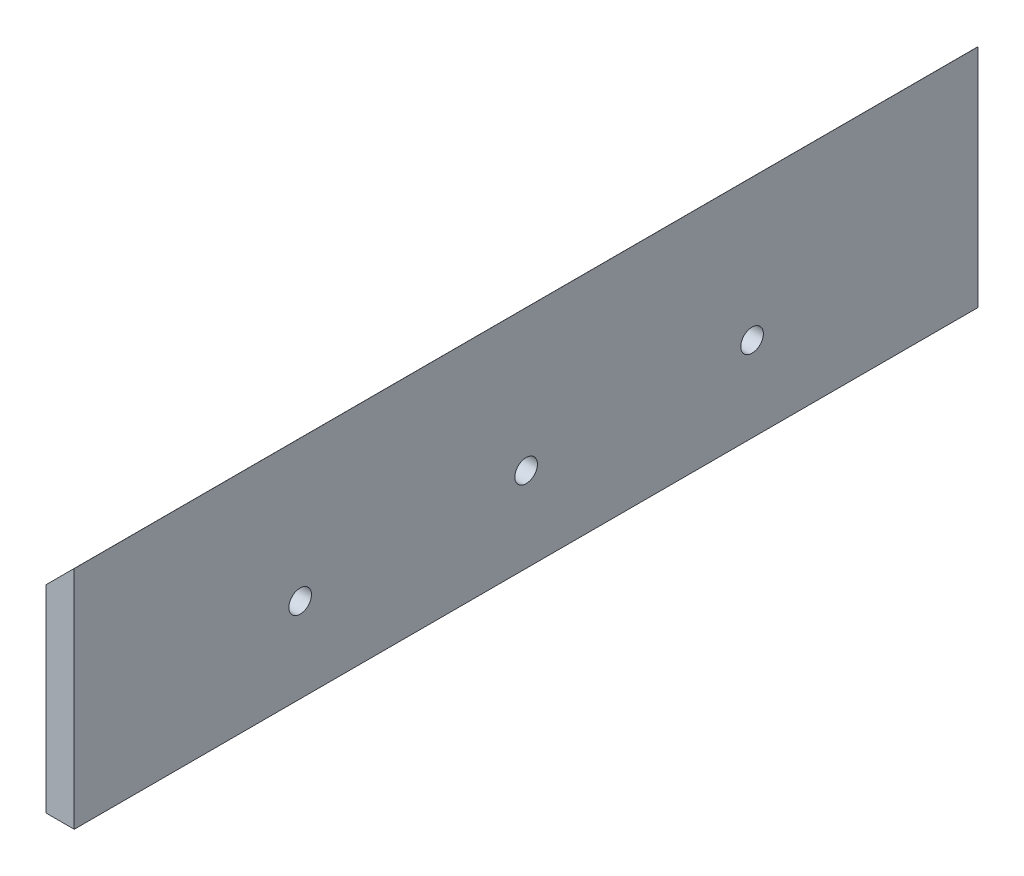
ISO-10303-21;
HEADER;
FILE_DESCRIPTION(('STEP AP214'),'2;1');
FILE_NAME('part.step','',(''),(''),'','','');
FILE_SCHEMA(('AUTOMOTIVE_DESIGN { 1 0 10303 214 1 1 1 1 }'));
ENDSEC;
DATA;
#1=APPLICATION_CONTEXT('core data for automotive mechanical design processes');
#2=APPLICATION_PROTOCOL_DEFINITION('international standard','automotive_design',2000,#1);
#3=PRODUCT_CONTEXT('',#1,'mechanical');
#4=PRODUCT('Part','Part','',(#3));
#5=PRODUCT_RELATED_PRODUCT_CATEGORY('part','',(#4));
#6=PRODUCT_DEFINITION_FORMATION('','',#4);
#7=PRODUCT_DEFINITION_CONTEXT('part definition',#1,'design');
#8=PRODUCT_DEFINITION('design','',#6,#7);
#9=PRODUCT_DEFINITION_SHAPE('','',#8);
#10=(LENGTH_UNIT() NAMED_UNIT(*) SI_UNIT(.MILLI.,.METRE.));
#11=(NAMED_UNIT(*) PLANE_ANGLE_UNIT() SI_UNIT($,.RADIAN.));
#12=(NAMED_UNIT(*) SI_UNIT($,.STERADIAN.) SOLID_ANGLE_UNIT());
#13=UNCERTAINTY_MEASURE_WITH_UNIT(LENGTH_MEASURE(1.E-05),#10,'distance_accuracy_value','');
#14=(GEOMETRIC_REPRESENTATION_CONTEXT(3) GLOBAL_UNCERTAINTY_ASSIGNED_CONTEXT((#13)) GLOBAL_UNIT_ASSIGNED_CONTEXT((#10,
#11,#12)) REPRESENTATION_CONTEXT('',''));
#15=CARTESIAN_POINT('',(0.,0.,0.));
#16=DIRECTION('',(0.,0.,1.));
#17=DIRECTION('',(1.,0.,0.));
#18=AXIS2_PLACEMENT_3D('',#15,#16,#17);
#19=CARTESIAN_POINT('',(203.623972774504,1041.16287141747,160.));
#20=DIRECTION('',(-1.,0.,0.));
#21=DIRECTION('',(0.,0.,1.));
#22=AXIS2_PLACEMENT_3D('',#19,#20,#21);
#23=PLANE('',#22);
#24=CARTESIAN_POINT('',(203.623972774504,1016.17690399324,80.));
#25=DIRECTION('',(1.,0.,0.));
#26=DIRECTION('',(0.,0.,-1.));
#27=AXIS2_PLACEMENT_3D('',#24,#25,#26);
#28=CIRCLE('',#27,2.);
#29=CARTESIAN_POINT('',(203.623972774504,1016.17690399324,78.));
#30=VERTEX_POINT('',#29);
#31=EDGE_CURVE('E126',#30,#30,#28,.T.);
#32=ORIENTED_EDGE('',*,*,#31,.F.);
#33=EDGE_LOOP('',(#32));
#34=FACE_BOUND('',#33,.T.);
#35=CARTESIAN_POINT('',(203.623972774504,1016.17690399324,120.));
#36=DIRECTION('',(1.,0.,0.));
#37=DIRECTION('',(0.,0.,-1.));
#38=AXIS2_PLACEMENT_3D('',#35,#36,#37);
#39=CIRCLE('',#38,2.);
#40=CARTESIAN_POINT('',(203.623972774504,1016.17690399324,118.));
#41=VERTEX_POINT('',#40);
#42=EDGE_CURVE('E127',#41,#41,#39,.T.);
#43=ORIENTED_EDGE('',*,*,#42,.F.);
#44=EDGE_LOOP('',(#43));
#45=FACE_BOUND('',#44,.T.);
#46=CARTESIAN_POINT('',(203.623972774504,1016.17690399324,40.));
#47=DIRECTION('',(1.,0.,0.));
#48=DIRECTION('',(0.,0.,-1.));
#49=AXIS2_PLACEMENT_3D('',#46,#47,#48);
#50=CIRCLE('',#49,2.);
#51=CARTESIAN_POINT('',(203.623972774504,1016.17690399324,38.));
#52=VERTEX_POINT('',#51);
#53=EDGE_CURVE('E119',#52,#52,#50,.T.);
#54=ORIENTED_EDGE('',*,*,#53,.F.);
#55=EDGE_LOOP('',(#54));
#56=FACE_BOUND('',#55,.T.);
#57=DIRECTION('',(0.,1.,0.));
#58=VECTOR('',#57,1.);
#59=CARTESIAN_POINT('',(203.623972774504,1041.16287141747,0.));
#60=LINE('',#59,#58);
#61=CARTESIAN_POINT('',(203.623972774504,1001.17690399324,0.));
#62=VERTEX_POINT('',#61);
#63=CARTESIAN_POINT('',(203.623972774504,1041.16287141747,0.));
#64=VERTEX_POINT('',#63);
#65=EDGE_CURVE('E96',#62,#64,#60,.T.);
#66=ORIENTED_EDGE('',*,*,#65,.T.);
#67=DIRECTION('',(0.,0.,-1.));
#68=VECTOR('',#67,1.);
#69=CARTESIAN_POINT('',(203.623972774504,1041.16287141747,160.));
#70=LINE('',#69,#68);
#71=CARTESIAN_POINT('',(203.623972774504,1041.16287141747,160.));
#72=VERTEX_POINT('',#71);
#73=EDGE_CURVE('E79',#72,#64,#70,.T.);
#74=ORIENTED_EDGE('',*,*,#73,.F.);
#75=DIRECTION('',(0.,1.,0.));
#76=VECTOR('',#75,1.);
#77=CARTESIAN_POINT('',(203.623972774504,1041.16287141747,160.));
#78=LINE('',#77,#76);
#79=CARTESIAN_POINT('',(203.623972774504,1001.17690399324,160.));
#80=VERTEX_POINT('',#79);
#81=EDGE_CURVE('E84',#80,#72,#78,.T.);
#82=ORIENTED_EDGE('',*,*,#81,.F.);
#83=DIRECTION('',(0.,0.,-1.));
#84=VECTOR('',#83,1.);
#85=CARTESIAN_POINT('',(203.623972774504,1001.17690399324,160.));
#86=LINE('',#85,#84);
#87=EDGE_CURVE('E103',#80,#62,#86,.T.);
#88=ORIENTED_EDGE('',*,*,#87,.T.);
#89=EDGE_LOOP('',(#66,#74,#82,#88));
#90=FACE_BOUND('',#89,.T.);
#91=ADVANCED_FACE('F32',(#34,#45,#56,#90),#23,.F.);
#92=CARTESIAN_POINT('',(198.623972774504,1041.17690399324,160.));
#93=DIRECTION('',(-0.002806504102076,-0.999996061759608,0.));
#94=DIRECTION('',(0.999996061759608,-0.002806504102076,0.));
#95=AXIS2_PLACEMENT_3D('',#92,#93,#94);
#96=PLANE('',#95);
#97=DIRECTION('',(-0.999996061759608,0.002806504102076,0.));
#98=VECTOR('',#97,1.);
#99=CARTESIAN_POINT('',(198.623972774504,1041.17690399324,0.));
#100=LINE('',#99,#98);
#101=CARTESIAN_POINT('',(203.609979471148,1041.16291068989,0.));
#102=VERTEX_POINT('',#101);
#103=EDGE_CURVE('E111',#64,#102,#100,.T.);
#104=ORIENTED_EDGE('',*,*,#103,.T.);
#105=DIRECTION('',(0.,0.,1.));
#106=VECTOR('',#105,1.);
#107=CARTESIAN_POINT('',(203.609979471148,1041.16291068989,160.));
#108=LINE('',#107,#106);
#109=CARTESIAN_POINT('',(203.609979471148,1041.16291068989,160.));
#110=VERTEX_POINT('',#109);
#111=EDGE_CURVE('E40',#102,#110,#108,.T.);
#112=ORIENTED_EDGE('',*,*,#111,.T.);
#113=DIRECTION('',(-0.999996061759608,0.002806504102076,0.));
#114=VECTOR('',#113,1.);
#115=CARTESIAN_POINT('',(198.623972774504,1041.17690399324,160.));
#116=LINE('',#115,#114);
#117=EDGE_CURVE('E75',#72,#110,#116,.T.);
#118=ORIENTED_EDGE('',*,*,#117,.F.);
#119=ORIENTED_EDGE('',*,*,#73,.T.);
#120=EDGE_LOOP('',(#104,#112,#118,#119));
#121=FACE_BOUND('',#120,.T.);
#122=ADVANCED_FACE('F77',(#121),#96,.F.);
#123=CARTESIAN_POINT('',(198.623972774504,1001.17690399324,160.));
#124=DIRECTION('',(1.,0.,0.));
#125=DIRECTION('',(0.,0.,-1.));
#126=AXIS2_PLACEMENT_3D('',#123,#124,#125);
#127=PLANE('',#126);
#128=CARTESIAN_POINT('',(198.623972774504,1016.17690399324,80.));
#129=DIRECTION('',(1.,0.,0.));
#130=DIRECTION('',(0.,0.,-1.));
#131=AXIS2_PLACEMENT_3D('',#128,#129,#130);
#132=CIRCLE('',#131,2.);
#133=CARTESIAN_POINT('',(198.623972774504,1016.17690399324,78.));
#134=VERTEX_POINT('',#133);
#135=EDGE_CURVE('E122',#134,#134,#132,.F.);
#136=ORIENTED_EDGE('',*,*,#135,.F.);
#137=EDGE_LOOP('',(#136));
#138=FACE_BOUND('',#137,.T.);
#139=CARTESIAN_POINT('',(198.623972774504,1016.17690399324,120.));
#140=DIRECTION('',(1.,0.,0.));
#141=DIRECTION('',(0.,0.,-1.));
#142=AXIS2_PLACEMENT_3D('',#139,#140,#141);
#143=CIRCLE('',#142,2.);
#144=CARTESIAN_POINT('',(198.623972774504,1016.17690399324,118.));
#145=VERTEX_POINT('',#144);
#146=EDGE_CURVE('E123',#145,#145,#143,.F.);
#147=ORIENTED_EDGE('',*,*,#146,.F.);
#148=EDGE_LOOP('',(#147));
#149=FACE_BOUND('',#148,.T.);
#150=CARTESIAN_POINT('',(198.623972774504,1016.17690399324,40.));
#151=DIRECTION('',(1.,0.,0.));
#152=DIRECTION('',(0.,0.,-1.));
#153=AXIS2_PLACEMENT_3D('',#150,#151,#152);
#154=CIRCLE('',#153,2.);
#155=CARTESIAN_POINT('',(198.623972774504,1016.17690399324,38.));
#156=VERTEX_POINT('',#155);
#157=EDGE_CURVE('E114',#156,#156,#154,.F.);
#158=ORIENTED_EDGE('',*,*,#157,.F.);
#159=EDGE_LOOP('',(#158));
#160=FACE_BOUND('',#159,.T.);
#161=DIRECTION('',(0.,-1.,0.));
#162=VECTOR('',#161,1.);
#163=CARTESIAN_POINT('',(198.623972774504,1001.17690399324,160.));
#164=LINE('',#163,#162);
#165=CARTESIAN_POINT('',(198.623972774504,1036.17690399324,160.));
#166=VERTEX_POINT('',#165);
#167=CARTESIAN_POINT('',(198.623972774504,1001.17690399324,160.));
#168=VERTEX_POINT('',#167);
#169=EDGE_CURVE('E83',#166,#168,#164,.T.);
#170=ORIENTED_EDGE('',*,*,#169,.F.);
#171=DIRECTION('',(0.,0.,-1.));
#172=VECTOR('',#171,1.);
#173=CARTESIAN_POINT('',(198.623972774504,1036.17690399324,160.));
#174=LINE('',#173,#172);
#175=CARTESIAN_POINT('',(198.623972774504,1036.17690399324,0.));
#176=VERTEX_POINT('',#175);
#177=EDGE_CURVE('E97',#166,#176,#174,.T.);
#178=ORIENTED_EDGE('',*,*,#177,.T.);
#179=DIRECTION('',(0.,-1.,0.));
#180=VECTOR('',#179,1.);
#181=CARTESIAN_POINT('',(198.623972774504,1001.17690399324,0.));
#182=LINE('',#181,#180);
#183=CARTESIAN_POINT('',(198.623972774504,1001.17690399324,0.));
#184=VERTEX_POINT('',#183);
#185=EDGE_CURVE('E109',#176,#184,#182,.T.);
#186=ORIENTED_EDGE('',*,*,#185,.T.);
#187=DIRECTION('',(0.,0.,-1.));
#188=VECTOR('',#187,1.);
#189=CARTESIAN_POINT('',(198.623972774504,1001.17690399324,160.));
#190=LINE('',#189,#188);
#191=EDGE_CURVE('E98',#168,#184,#190,.T.);
#192=ORIENTED_EDGE('',*,*,#191,.F.);
#193=EDGE_LOOP('',(#170,#178,#186,#192));
#194=FACE_BOUND('',#193,.T.);
#195=ADVANCED_FACE('F165',(#138,#149,#160,#194),#127,.F.);
#196=CARTESIAN_POINT('',(203.623972774504,1001.17690399324,160.));
#197=DIRECTION('',(0.,1.,0.));
#198=DIRECTION('',(0.,0.,1.));
#199=AXIS2_PLACEMENT_3D('',#196,#197,#198);
#200=PLANE('',#199);
#201=DIRECTION('',(1.,0.,0.));
#202=VECTOR('',#201,1.);
#203=CARTESIAN_POINT('',(203.623972774504,1001.17690399324,0.));
#204=LINE('',#203,#202);
#205=EDGE_CURVE('E93',#184,#62,#204,.T.);
#206=ORIENTED_EDGE('',*,*,#205,.T.);
#207=ORIENTED_EDGE('',*,*,#87,.F.);
#208=DIRECTION('',(1.,0.,0.));
#209=VECTOR('',#208,1.);
#210=CARTESIAN_POINT('',(203.623972774504,1001.17690399324,160.));
#211=LINE('',#210,#209);
#212=EDGE_CURVE('E89',#168,#80,#211,.T.);
#213=ORIENTED_EDGE('',*,*,#212,.F.);
#214=ORIENTED_EDGE('',*,*,#191,.T.);
#215=EDGE_LOOP('',(#206,#207,#213,#214));
#216=FACE_BOUND('',#215,.T.);
#217=ADVANCED_FACE('F160',(#216),#200,.F.);
#218=CARTESIAN_POINT('',(0.,0.,160.));
#219=DIRECTION('',(0.,0.,-1.));
#220=DIRECTION('',(-1.,0.,0.));
#221=AXIS2_PLACEMENT_3D('',#218,#219,#220);
#222=PLANE('',#221);
#223=ORIENTED_EDGE('',*,*,#117,.T.);
#224=DIRECTION('',(0.707106781186538,0.707106781186557,0.));
#225=VECTOR('',#224,1.);
#226=CARTESIAN_POINT('',(198.623972774504,1036.17690399324,160.));
#227=LINE('',#226,#225);
#228=EDGE_CURVE('E11',#110,#166,#227,.F.);
#229=ORIENTED_EDGE('',*,*,#228,.T.);
#230=ORIENTED_EDGE('',*,*,#169,.T.);
#231=ORIENTED_EDGE('',*,*,#212,.T.);
#232=ORIENTED_EDGE('',*,*,#81,.T.);
#233=EDGE_LOOP('',(#223,#229,#230,#231,#232));
#234=FACE_BOUND('',#233,.T.);
#235=ADVANCED_FACE('F87',(#234),#222,.F.);
#236=CARTESIAN_POINT('',(0.,0.,0.));
#237=DIRECTION('',(0.,0.,-1.));
#238=DIRECTION('',(-1.,0.,0.));
#239=AXIS2_PLACEMENT_3D('',#236,#237,#238);
#240=PLANE('',#239);
#241=ORIENTED_EDGE('',*,*,#185,.F.);
#242=DIRECTION('',(-0.707106781186538,-0.707106781186557,0.));
#243=VECTOR('',#242,1.);
#244=CARTESIAN_POINT('',(-418.776465609366,418.776465609354,0.));
#245=LINE('',#244,#243);
#246=EDGE_CURVE('E54',#176,#102,#245,.F.);
#247=ORIENTED_EDGE('',*,*,#246,.T.);
#248=ORIENTED_EDGE('',*,*,#103,.F.);
#249=ORIENTED_EDGE('',*,*,#65,.F.);
#250=ORIENTED_EDGE('',*,*,#205,.F.);
#251=EDGE_LOOP('',(#241,#247,#248,#249,#250));
#252=FACE_BOUND('',#251,.T.);
#253=ADVANCED_FACE('F154',(#252),#240,.T.);
#254=CARTESIAN_POINT('',(198.623972774504,1036.17690399324,160.));
#255=DIRECTION('',(0.707106781186557,-0.707106781186538,0.));
#256=DIRECTION('',(0.,0.,-1.));
#257=AXIS2_PLACEMENT_3D('',#254,#255,#256);
#258=PLANE('',#257);
#259=ORIENTED_EDGE('',*,*,#228,.F.);
#260=ORIENTED_EDGE('',*,*,#111,.F.);
#261=ORIENTED_EDGE('',*,*,#246,.F.);
#262=ORIENTED_EDGE('',*,*,#177,.F.);
#263=EDGE_LOOP('',(#259,#260,#261,#262));
#264=FACE_BOUND('',#263,.T.);
#265=ADVANCED_FACE('F34',(#264),#258,.F.);
#266=CARTESIAN_POINT('',(192.967118525012,1016.17690399324,40.));
#267=DIRECTION('',(1.,0.,0.));
#268=DIRECTION('',(0.,0.,-1.));
#269=AXIS2_PLACEMENT_3D('',#266,#267,#268);
#270=CYLINDRICAL_SURFACE('',#269,2.);
#271=ORIENTED_EDGE('',*,*,#157,.T.);
#272=EDGE_LOOP('',(#271));
#273=FACE_BOUND('',#272,.T.);
#274=ORIENTED_EDGE('',*,*,#53,.T.);
#275=EDGE_LOOP('',(#274));
#276=FACE_BOUND('',#275,.T.);
#277=ADVANCED_FACE('F143',(#273,#276),#270,.F.);
#278=CARTESIAN_POINT('',(192.967118525012,1016.17690399324,120.));
#279=DIRECTION('',(1.,0.,0.));
#280=DIRECTION('',(0.,0.,-1.));
#281=AXIS2_PLACEMENT_3D('',#278,#279,#280);
#282=CYLINDRICAL_SURFACE('',#281,2.);
#283=ORIENTED_EDGE('',*,*,#146,.T.);
#284=EDGE_LOOP('',(#283));
#285=FACE_BOUND('',#284,.T.);
#286=ORIENTED_EDGE('',*,*,#42,.T.);
#287=EDGE_LOOP('',(#286));
#288=FACE_BOUND('',#287,.T.);
#289=ADVANCED_FACE('F145',(#285,#288),#282,.F.);
#290=CARTESIAN_POINT('',(192.967118525012,1016.17690399324,80.));
#291=DIRECTION('',(1.,0.,0.));
#292=DIRECTION('',(0.,0.,-1.));
#293=AXIS2_PLACEMENT_3D('',#290,#291,#292);
#294=CYLINDRICAL_SURFACE('',#293,2.);
#295=ORIENTED_EDGE('',*,*,#135,.T.);
#296=EDGE_LOOP('',(#295));
#297=FACE_BOUND('',#296,.T.);
#298=ORIENTED_EDGE('',*,*,#31,.T.);
#299=EDGE_LOOP('',(#298));
#300=FACE_BOUND('',#299,.T.);
#301=ADVANCED_FACE('F135',(#297,#300),#294,.F.);
#302=CLOSED_SHELL('',(#91,#122,#195,#217,#235,#253,#265,#277,#289,#301));
#303=MANIFOLD_SOLID_BREP('B2',#302);
#304=ADVANCED_BREP_SHAPE_REPRESENTATION('',(#18,#303),#14);
#305=SHAPE_DEFINITION_REPRESENTATION(#9,#304);
ENDSEC;
END-ISO-10303-21;
